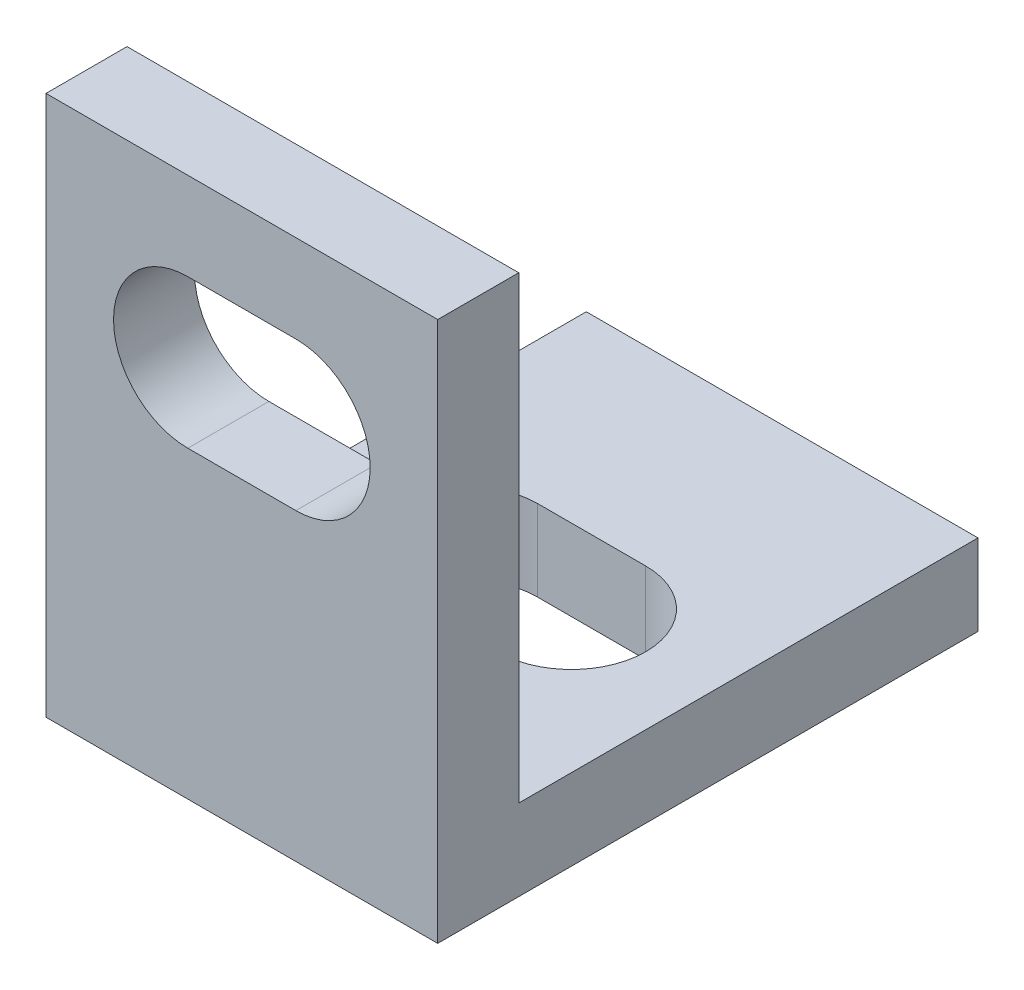
ISO-10303-21;
HEADER;
FILE_DESCRIPTION(('STEP AP214'),'2;1');
FILE_NAME('part.step','',(''),(''),'','','');
FILE_SCHEMA(('AUTOMOTIVE_DESIGN { 1 0 10303 214 1 1 1 1 }'));
ENDSEC;
DATA;
#1=APPLICATION_CONTEXT('core data for automotive mechanical design processes');
#2=APPLICATION_PROTOCOL_DEFINITION('international standard','automotive_design',2000,#1);
#3=PRODUCT_CONTEXT('',#1,'mechanical');
#4=PRODUCT('Part','Part','',(#3));
#5=PRODUCT_RELATED_PRODUCT_CATEGORY('part','',(#4));
#6=PRODUCT_DEFINITION_FORMATION('','',#4);
#7=PRODUCT_DEFINITION_CONTEXT('part definition',#1,'design');
#8=PRODUCT_DEFINITION('design','',#6,#7);
#9=PRODUCT_DEFINITION_SHAPE('','',#8);
#10=(LENGTH_UNIT() NAMED_UNIT(*) SI_UNIT(.MILLI.,.METRE.));
#11=(NAMED_UNIT(*) PLANE_ANGLE_UNIT() SI_UNIT($,.RADIAN.));
#12=(NAMED_UNIT(*) SI_UNIT($,.STERADIAN.) SOLID_ANGLE_UNIT());
#13=UNCERTAINTY_MEASURE_WITH_UNIT(LENGTH_MEASURE(1.E-05),#10,'distance_accuracy_value','');
#14=(GEOMETRIC_REPRESENTATION_CONTEXT(3) GLOBAL_UNCERTAINTY_ASSIGNED_CONTEXT((#13)) GLOBAL_UNIT_ASSIGNED_CONTEXT((#10,
#11,#12)) REPRESENTATION_CONTEXT('',''));
#15=CARTESIAN_POINT('',(0.,0.,0.));
#16=DIRECTION('',(0.,0.,1.));
#17=DIRECTION('',(1.,0.,0.));
#18=AXIS2_PLACEMENT_3D('',#15,#16,#17);
#19=CARTESIAN_POINT('',(14.5,0.,-20.));
#20=DIRECTION('',(0.,1.,0.));
#21=DIRECTION('',(0.,0.,1.));
#22=AXIS2_PLACEMENT_3D('',#19,#20,#21);
#23=PLANE('',#22);
#24=DIRECTION('',(1.,0.,0.));
#25=VECTOR('',#24,1.);
#26=CARTESIAN_POINT('',(5.25,0.,-12.95));
#27=LINE('',#26,#25);
#28=CARTESIAN_POINT('',(5.25,0.,-12.95));
#29=VERTEX_POINT('',#28);
#30=CARTESIAN_POINT('',(9.25,0.,-12.95));
#31=VERTEX_POINT('',#30);
#32=EDGE_CURVE('E151',#29,#31,#27,.T.);
#33=ORIENTED_EDGE('',*,*,#32,.F.);
#34=CARTESIAN_POINT('',(5.25,0.,-10.2));
#35=DIRECTION('',(0.,-1.,0.));
#36=DIRECTION('',(0.,0.,-1.));
#37=AXIS2_PLACEMENT_3D('',#34,#35,#36);
#38=CIRCLE('',#37,2.75);
#39=CARTESIAN_POINT('',(5.25,0.,-7.45));
#40=VERTEX_POINT('',#39);
#41=EDGE_CURVE('E53',#40,#29,#38,.T.);
#42=ORIENTED_EDGE('',*,*,#41,.F.);
#43=DIRECTION('',(-1.,0.,0.));
#44=VECTOR('',#43,1.);
#45=CARTESIAN_POINT('',(5.25,0.,-7.45));
#46=LINE('',#45,#44);
#47=CARTESIAN_POINT('',(9.25,0.,-7.45));
#48=VERTEX_POINT('',#47);
#49=EDGE_CURVE('E157',#48,#40,#46,.T.);
#50=ORIENTED_EDGE('',*,*,#49,.F.);
#51=CARTESIAN_POINT('',(9.25,0.,-10.2));
#52=DIRECTION('',(0.,-1.,0.));
#53=DIRECTION('',(0.,0.,-1.));
#54=AXIS2_PLACEMENT_3D('',#51,#52,#53);
#55=CIRCLE('',#54,2.75);
#56=EDGE_CURVE('E142',#31,#48,#55,.T.);
#57=ORIENTED_EDGE('',*,*,#56,.F.);
#58=EDGE_LOOP('',(#33,#42,#50,#57));
#59=FACE_BOUND('',#58,.T.);
#60=DIRECTION('',(0.,0.,-1.));
#61=VECTOR('',#60,1.);
#62=CARTESIAN_POINT('',(0.,0.,-20.));
#63=LINE('',#62,#61);
#64=CARTESIAN_POINT('',(0.,0.,0.));
#65=VERTEX_POINT('',#64);
#66=CARTESIAN_POINT('',(0.,0.,-20.));
#67=VERTEX_POINT('',#66);
#68=EDGE_CURVE('E198',#65,#67,#63,.T.);
#69=ORIENTED_EDGE('',*,*,#68,.T.);
#70=DIRECTION('',(-1.,0.,0.));
#71=VECTOR('',#70,1.);
#72=CARTESIAN_POINT('',(14.5,0.,-20.));
#73=LINE('',#72,#71);
#74=CARTESIAN_POINT('',(14.5,0.,-20.));
#75=VERTEX_POINT('',#74);
#76=EDGE_CURVE('E239',#75,#67,#73,.T.);
#77=ORIENTED_EDGE('',*,*,#76,.F.);
#78=DIRECTION('',(0.,0.,-1.));
#79=VECTOR('',#78,1.);
#80=CARTESIAN_POINT('',(14.5,0.,-20.));
#81=LINE('',#80,#79);
#82=CARTESIAN_POINT('',(14.5,0.,0.));
#83=VERTEX_POINT('',#82);
#84=EDGE_CURVE('E199',#83,#75,#81,.T.);
#85=ORIENTED_EDGE('',*,*,#84,.F.);
#86=DIRECTION('',(-1.,0.,0.));
#87=VECTOR('',#86,1.);
#88=CARTESIAN_POINT('',(14.5,0.,0.));
#89=LINE('',#88,#87);
#90=EDGE_CURVE('E213',#83,#65,#89,.T.);
#91=ORIENTED_EDGE('',*,*,#90,.T.);
#92=EDGE_LOOP('',(#69,#77,#85,#91));
#93=FACE_BOUND('',#92,.T.);
#94=ADVANCED_FACE('F39',(#59,#93),#23,.F.);
#95=CARTESIAN_POINT('',(14.5,3.,-20.));
#96=DIRECTION('',(0.,0.,1.));
#97=DIRECTION('',(1.,0.,0.));
#98=AXIS2_PLACEMENT_3D('',#95,#96,#97);
#99=PLANE('',#98);
#100=DIRECTION('',(0.,1.,0.));
#101=VECTOR('',#100,1.);
#102=CARTESIAN_POINT('',(0.,3.,-20.));
#103=LINE('',#102,#101);
#104=CARTESIAN_POINT('',(0.,3.,-20.));
#105=VERTEX_POINT('',#104);
#106=EDGE_CURVE('E216',#67,#105,#103,.T.);
#107=ORIENTED_EDGE('',*,*,#106,.T.);
#108=DIRECTION('',(-1.,0.,0.));
#109=VECTOR('',#108,1.);
#110=CARTESIAN_POINT('',(14.5,3.,-20.));
#111=LINE('',#110,#109);
#112=CARTESIAN_POINT('',(14.5,3.,-20.));
#113=VERTEX_POINT('',#112);
#114=EDGE_CURVE('E236',#113,#105,#111,.T.);
#115=ORIENTED_EDGE('',*,*,#114,.F.);
#116=DIRECTION('',(0.,1.,0.));
#117=VECTOR('',#116,1.);
#118=CARTESIAN_POINT('',(14.5,3.,-20.));
#119=LINE('',#118,#117);
#120=EDGE_CURVE('E202',#75,#113,#119,.T.);
#121=ORIENTED_EDGE('',*,*,#120,.F.);
#122=ORIENTED_EDGE('',*,*,#76,.T.);
#123=EDGE_LOOP('',(#107,#115,#121,#122));
#124=FACE_BOUND('',#123,.T.);
#125=ADVANCED_FACE('F267',(#124),#99,.F.);
#126=CARTESIAN_POINT('',(14.5,3.,-3.));
#127=DIRECTION('',(0.,-1.,0.));
#128=DIRECTION('',(0.,0.,-1.));
#129=AXIS2_PLACEMENT_3D('',#126,#127,#128);
#130=PLANE('',#129);
#131=DIRECTION('',(-1.,0.,0.));
#132=VECTOR('',#131,1.);
#133=CARTESIAN_POINT('',(14.5,3.,-7.45));
#134=LINE('',#133,#132);
#135=CARTESIAN_POINT('',(9.25,3.,-7.45));
#136=VERTEX_POINT('',#135);
#137=CARTESIAN_POINT('',(5.25,3.,-7.45));
#138=VERTEX_POINT('',#137);
#139=EDGE_CURVE('E46',#136,#138,#134,.T.);
#140=ORIENTED_EDGE('',*,*,#139,.T.);
#141=CARTESIAN_POINT('',(5.25,3.,-10.2));
#142=DIRECTION('',(0.,-1.,0.));
#143=DIRECTION('',(0.,0.,-1.));
#144=AXIS2_PLACEMENT_3D('',#141,#142,#143);
#145=CIRCLE('',#144,2.75);
#146=CARTESIAN_POINT('',(5.25,3.,-12.95));
#147=VERTEX_POINT('',#146);
#148=EDGE_CURVE('E11',#138,#147,#145,.T.);
#149=ORIENTED_EDGE('',*,*,#148,.T.);
#150=DIRECTION('',(1.,0.,0.));
#151=VECTOR('',#150,1.);
#152=CARTESIAN_POINT('',(14.5,3.,-12.95));
#153=LINE('',#152,#151);
#154=CARTESIAN_POINT('',(9.25,3.,-12.95));
#155=VERTEX_POINT('',#154);
#156=EDGE_CURVE('E242',#147,#155,#153,.T.);
#157=ORIENTED_EDGE('',*,*,#156,.T.);
#158=CARTESIAN_POINT('',(9.25,3.,-10.2));
#159=DIRECTION('',(0.,-1.,0.));
#160=DIRECTION('',(0.,0.,-1.));
#161=AXIS2_PLACEMENT_3D('',#158,#159,#160);
#162=CIRCLE('',#161,2.75);
#163=EDGE_CURVE('E145',#155,#136,#162,.T.);
#164=ORIENTED_EDGE('',*,*,#163,.T.);
#165=EDGE_LOOP('',(#140,#149,#157,#164));
#166=FACE_BOUND('',#165,.T.);
#167=DIRECTION('',(0.,0.,1.));
#168=VECTOR('',#167,1.);
#169=CARTESIAN_POINT('',(0.,3.,-3.));
#170=LINE('',#169,#168);
#171=CARTESIAN_POINT('',(0.,3.,-3.));
#172=VERTEX_POINT('',#171);
#173=EDGE_CURVE('E218',#105,#172,#170,.T.);
#174=ORIENTED_EDGE('',*,*,#173,.T.);
#175=DIRECTION('',(-1.,0.,0.));
#176=VECTOR('',#175,1.);
#177=CARTESIAN_POINT('',(14.5,3.,-3.));
#178=LINE('',#177,#176);
#179=CARTESIAN_POINT('',(14.5,3.,-3.));
#180=VERTEX_POINT('',#179);
#181=EDGE_CURVE('E233',#180,#172,#178,.T.);
#182=ORIENTED_EDGE('',*,*,#181,.F.);
#183=DIRECTION('',(0.,0.,1.));
#184=VECTOR('',#183,1.);
#185=CARTESIAN_POINT('',(14.5,3.,-3.));
#186=LINE('',#185,#184);
#187=EDGE_CURVE('E205',#113,#180,#186,.T.);
#188=ORIENTED_EDGE('',*,*,#187,.F.);
#189=ORIENTED_EDGE('',*,*,#114,.T.);
#190=EDGE_LOOP('',(#174,#182,#188,#189));
#191=FACE_BOUND('',#190,.T.);
#192=ADVANCED_FACE('F246',(#166,#191),#130,.F.);
#193=CARTESIAN_POINT('',(14.5,20.,-3.));
#194=DIRECTION('',(0.,0.,1.));
#195=DIRECTION('',(0.,-1.,0.));
#196=AXIS2_PLACEMENT_3D('',#193,#194,#195);
#197=PLANE('',#196);
#198=CARTESIAN_POINT('',(5.25,14.,-3.));
#199=DIRECTION('',(0.,0.,1.));
#200=DIRECTION('',(0.,-1.,0.));
#201=AXIS2_PLACEMENT_3D('',#198,#199,#200);
#202=CIRCLE('',#201,2.75);
#203=CARTESIAN_POINT('',(5.25,16.75,-3.));
#204=VERTEX_POINT('',#203);
#205=CARTESIAN_POINT('',(5.25,11.25,-3.));
#206=VERTEX_POINT('',#205);
#207=EDGE_CURVE('E192',#204,#206,#202,.T.);
#208=ORIENTED_EDGE('',*,*,#207,.T.);
#209=DIRECTION('',(1.,0.,0.));
#210=VECTOR('',#209,1.);
#211=CARTESIAN_POINT('',(14.5,11.25,-3.));
#212=LINE('',#211,#210);
#213=CARTESIAN_POINT('',(9.25,11.25,-3.));
#214=VERTEX_POINT('',#213);
#215=EDGE_CURVE('E195',#206,#214,#212,.T.);
#216=ORIENTED_EDGE('',*,*,#215,.T.);
#217=CARTESIAN_POINT('',(9.25,14.,-3.));
#218=DIRECTION('',(0.,0.,1.));
#219=DIRECTION('',(0.,-1.,0.));
#220=AXIS2_PLACEMENT_3D('',#217,#218,#219);
#221=CIRCLE('',#220,2.75);
#222=CARTESIAN_POINT('',(9.25,16.75,-3.));
#223=VERTEX_POINT('',#222);
#224=EDGE_CURVE('E180',#214,#223,#221,.T.);
#225=ORIENTED_EDGE('',*,*,#224,.T.);
#226=DIRECTION('',(1.,0.,0.));
#227=VECTOR('',#226,1.);
#228=CARTESIAN_POINT('',(14.5,16.75,-3.));
#229=LINE('',#228,#227);
#230=EDGE_CURVE('E189',#204,#223,#229,.T.);
#231=ORIENTED_EDGE('',*,*,#230,.F.);
#232=EDGE_LOOP('',(#208,#216,#225,#231));
#233=FACE_BOUND('',#232,.T.);
#234=DIRECTION('',(0.,1.,0.));
#235=VECTOR('',#234,1.);
#236=CARTESIAN_POINT('',(0.,20.,-3.));
#237=LINE('',#236,#235);
#238=CARTESIAN_POINT('',(0.,20.,-3.));
#239=VERTEX_POINT('',#238);
#240=EDGE_CURVE('E220',#172,#239,#237,.T.);
#241=ORIENTED_EDGE('',*,*,#240,.T.);
#242=DIRECTION('',(-1.,0.,0.));
#243=VECTOR('',#242,1.);
#244=CARTESIAN_POINT('',(14.5,20.,-3.));
#245=LINE('',#244,#243);
#246=CARTESIAN_POINT('',(14.5,20.,-3.));
#247=VERTEX_POINT('',#246);
#248=EDGE_CURVE('E230',#247,#239,#245,.T.);
#249=ORIENTED_EDGE('',*,*,#248,.F.);
#250=DIRECTION('',(0.,1.,0.));
#251=VECTOR('',#250,1.);
#252=CARTESIAN_POINT('',(14.5,20.,-3.));
#253=LINE('',#252,#251);
#254=EDGE_CURVE('E207',#180,#247,#253,.T.);
#255=ORIENTED_EDGE('',*,*,#254,.F.);
#256=ORIENTED_EDGE('',*,*,#181,.T.);
#257=EDGE_LOOP('',(#241,#249,#255,#256));
#258=FACE_BOUND('',#257,.T.);
#259=ADVANCED_FACE('F275',(#233,#258),#197,.F.);
#260=CARTESIAN_POINT('',(14.5,20.,0.));
#261=DIRECTION('',(0.,-1.,0.));
#262=DIRECTION('',(0.,0.,-1.));
#263=AXIS2_PLACEMENT_3D('',#260,#261,#262);
#264=PLANE('',#263);
#265=DIRECTION('',(0.,0.,1.));
#266=VECTOR('',#265,1.);
#267=CARTESIAN_POINT('',(0.,20.,0.));
#268=LINE('',#267,#266);
#269=CARTESIAN_POINT('',(0.,20.,0.));
#270=VERTEX_POINT('',#269);
#271=EDGE_CURVE('E222',#239,#270,#268,.T.);
#272=ORIENTED_EDGE('',*,*,#271,.T.);
#273=DIRECTION('',(-1.,0.,0.));
#274=VECTOR('',#273,1.);
#275=CARTESIAN_POINT('',(14.5,20.,0.));
#276=LINE('',#275,#274);
#277=CARTESIAN_POINT('',(14.5,20.,0.));
#278=VERTEX_POINT('',#277);
#279=EDGE_CURVE('E227',#278,#270,#276,.T.);
#280=ORIENTED_EDGE('',*,*,#279,.F.);
#281=DIRECTION('',(0.,0.,1.));
#282=VECTOR('',#281,1.);
#283=CARTESIAN_POINT('',(14.5,20.,0.));
#284=LINE('',#283,#282);
#285=EDGE_CURVE('E209',#247,#278,#284,.T.);
#286=ORIENTED_EDGE('',*,*,#285,.F.);
#287=ORIENTED_EDGE('',*,*,#248,.T.);
#288=EDGE_LOOP('',(#272,#280,#286,#287));
#289=FACE_BOUND('',#288,.T.);
#290=ADVANCED_FACE('F280',(#289),#264,.F.);
#291=CARTESIAN_POINT('',(14.5,0.,0.));
#292=DIRECTION('',(0.,0.,-1.));
#293=DIRECTION('',(-1.,0.,0.));
#294=AXIS2_PLACEMENT_3D('',#291,#292,#293);
#295=PLANE('',#294);
#296=CARTESIAN_POINT('',(9.25,14.,0.));
#297=DIRECTION('',(0.,0.,1.));
#298=DIRECTION('',(1.,0.,0.));
#299=AXIS2_PLACEMENT_3D('',#296,#297,#298);
#300=CIRCLE('',#299,2.75);
#301=CARTESIAN_POINT('',(9.25,11.25,0.));
#302=VERTEX_POINT('',#301);
#303=CARTESIAN_POINT('',(9.25,16.75,0.));
#304=VERTEX_POINT('',#303);
#305=EDGE_CURVE('E168',#302,#304,#300,.T.);
#306=ORIENTED_EDGE('',*,*,#305,.F.);
#307=DIRECTION('',(1.,0.,0.));
#308=VECTOR('',#307,1.);
#309=CARTESIAN_POINT('',(5.25,11.25,0.));
#310=LINE('',#309,#308);
#311=CARTESIAN_POINT('',(5.25,11.25,0.));
#312=VERTEX_POINT('',#311);
#313=EDGE_CURVE('E164',#312,#302,#310,.T.);
#314=ORIENTED_EDGE('',*,*,#313,.F.);
#315=CARTESIAN_POINT('',(5.25,14.,0.));
#316=DIRECTION('',(0.,0.,1.));
#317=DIRECTION('',(1.,0.,0.));
#318=AXIS2_PLACEMENT_3D('',#315,#316,#317);
#319=CIRCLE('',#318,2.75);
#320=CARTESIAN_POINT('',(5.25,16.75,0.));
#321=VERTEX_POINT('',#320);
#322=EDGE_CURVE('E174',#321,#312,#319,.T.);
#323=ORIENTED_EDGE('',*,*,#322,.F.);
#324=DIRECTION('',(1.,0.,0.));
#325=VECTOR('',#324,1.);
#326=CARTESIAN_POINT('',(5.25,16.75,0.));
#327=LINE('',#326,#325);
#328=EDGE_CURVE('E171',#321,#304,#327,.T.);
#329=ORIENTED_EDGE('',*,*,#328,.T.);
#330=EDGE_LOOP('',(#306,#314,#323,#329));
#331=FACE_BOUND('',#330,.T.);
#332=DIRECTION('',(0.,-1.,0.));
#333=VECTOR('',#332,1.);
#334=CARTESIAN_POINT('',(0.,0.,0.));
#335=LINE('',#334,#333);
#336=EDGE_CURVE('E203',#270,#65,#335,.T.);
#337=ORIENTED_EDGE('',*,*,#336,.T.);
#338=ORIENTED_EDGE('',*,*,#90,.F.);
#339=DIRECTION('',(0.,-1.,0.));
#340=VECTOR('',#339,1.);
#341=CARTESIAN_POINT('',(14.5,0.,0.));
#342=LINE('',#341,#340);
#343=EDGE_CURVE('E211',#278,#83,#342,.T.);
#344=ORIENTED_EDGE('',*,*,#343,.F.);
#345=ORIENTED_EDGE('',*,*,#279,.T.);
#346=EDGE_LOOP('',(#337,#338,#344,#345));
#347=FACE_BOUND('',#346,.T.);
#348=ADVANCED_FACE('F283',(#331,#347),#295,.F.);
#349=CARTESIAN_POINT('',(14.5,0.,0.));
#350=DIRECTION('',(-1.,0.,0.));
#351=DIRECTION('',(0.,0.,1.));
#352=AXIS2_PLACEMENT_3D('',#349,#350,#351);
#353=PLANE('',#352);
#354=ORIENTED_EDGE('',*,*,#84,.T.);
#355=ORIENTED_EDGE('',*,*,#120,.T.);
#356=ORIENTED_EDGE('',*,*,#187,.T.);
#357=ORIENTED_EDGE('',*,*,#254,.T.);
#358=ORIENTED_EDGE('',*,*,#285,.T.);
#359=ORIENTED_EDGE('',*,*,#343,.T.);
#360=EDGE_LOOP('',(#354,#355,#356,#357,#358,#359));
#361=FACE_BOUND('',#360,.T.);
#362=ADVANCED_FACE('F287',(#361),#353,.F.);
#363=CARTESIAN_POINT('',(0.,0.,0.));
#364=DIRECTION('',(-1.,0.,0.));
#365=DIRECTION('',(0.,0.,1.));
#366=AXIS2_PLACEMENT_3D('',#363,#364,#365);
#367=PLANE('',#366);
#368=ORIENTED_EDGE('',*,*,#68,.F.);
#369=ORIENTED_EDGE('',*,*,#336,.F.);
#370=ORIENTED_EDGE('',*,*,#271,.F.);
#371=ORIENTED_EDGE('',*,*,#240,.F.);
#372=ORIENTED_EDGE('',*,*,#173,.F.);
#373=ORIENTED_EDGE('',*,*,#106,.F.);
#374=EDGE_LOOP('',(#368,#369,#370,#371,#372,#373));
#375=FACE_BOUND('',#374,.T.);
#376=ADVANCED_FACE('F289',(#375),#367,.T.);
#377=CARTESIAN_POINT('',(5.25,11.25,-20.));
#378=DIRECTION('',(0.,-1.,0.));
#379=DIRECTION('',(0.,0.,-1.));
#380=AXIS2_PLACEMENT_3D('',#377,#378,#379);
#381=PLANE('',#380);
#382=DIRECTION('',(0.,0.,1.));
#383=VECTOR('',#382,1.);
#384=CARTESIAN_POINT('',(5.25,11.25,-20.));
#385=LINE('',#384,#383);
#386=EDGE_CURVE('E178',#206,#312,#385,.T.);
#387=ORIENTED_EDGE('',*,*,#386,.T.);
#388=ORIENTED_EDGE('',*,*,#313,.T.);
#389=DIRECTION('',(0.,0.,1.));
#390=VECTOR('',#389,1.);
#391=CARTESIAN_POINT('',(9.25,11.25,-20.));
#392=LINE('',#391,#390);
#393=EDGE_CURVE('E177',#214,#302,#392,.T.);
#394=ORIENTED_EDGE('',*,*,#393,.F.);
#395=ORIENTED_EDGE('',*,*,#215,.F.);
#396=EDGE_LOOP('',(#387,#388,#394,#395));
#397=FACE_BOUND('',#396,.T.);
#398=ADVANCED_FACE('F292',(#397),#381,.F.);
#399=CARTESIAN_POINT('',(5.25,14.,-20.));
#400=DIRECTION('',(0.,0.,1.));
#401=DIRECTION('',(1.,0.,0.));
#402=AXIS2_PLACEMENT_3D('',#399,#400,#401);
#403=CYLINDRICAL_SURFACE('',#402,2.75);
#404=DIRECTION('',(0.,0.,1.));
#405=VECTOR('',#404,1.);
#406=CARTESIAN_POINT('',(5.25,16.75,-20.));
#407=LINE('',#406,#405);
#408=EDGE_CURVE('E181',#204,#321,#407,.T.);
#409=ORIENTED_EDGE('',*,*,#408,.T.);
#410=ORIENTED_EDGE('',*,*,#322,.T.);
#411=ORIENTED_EDGE('',*,*,#386,.F.);
#412=ORIENTED_EDGE('',*,*,#207,.F.);
#413=EDGE_LOOP('',(#409,#410,#411,#412));
#414=FACE_BOUND('',#413,.T.);
#415=ADVANCED_FACE('F298',(#414),#403,.F.);
#416=CARTESIAN_POINT('',(5.25,16.75,-20.));
#417=DIRECTION('',(0.,-1.,0.));
#418=DIRECTION('',(0.,0.,-1.));
#419=AXIS2_PLACEMENT_3D('',#416,#417,#418);
#420=PLANE('',#419);
#421=ORIENTED_EDGE('',*,*,#230,.T.);
#422=DIRECTION('',(0.,0.,1.));
#423=VECTOR('',#422,1.);
#424=CARTESIAN_POINT('',(9.25,16.75,-20.));
#425=LINE('',#424,#423);
#426=EDGE_CURVE('E183',#223,#304,#425,.T.);
#427=ORIENTED_EDGE('',*,*,#426,.T.);
#428=ORIENTED_EDGE('',*,*,#328,.F.);
#429=ORIENTED_EDGE('',*,*,#408,.F.);
#430=EDGE_LOOP('',(#421,#427,#428,#429));
#431=FACE_BOUND('',#430,.T.);
#432=ADVANCED_FACE('F261',(#431),#420,.T.);
#433=CARTESIAN_POINT('',(9.25,14.,-20.));
#434=DIRECTION('',(0.,0.,1.));
#435=DIRECTION('',(1.,0.,0.));
#436=AXIS2_PLACEMENT_3D('',#433,#434,#435);
#437=CYLINDRICAL_SURFACE('',#436,2.75);
#438=ORIENTED_EDGE('',*,*,#393,.T.);
#439=ORIENTED_EDGE('',*,*,#305,.T.);
#440=ORIENTED_EDGE('',*,*,#426,.F.);
#441=ORIENTED_EDGE('',*,*,#224,.F.);
#442=EDGE_LOOP('',(#438,#439,#440,#441));
#443=FACE_BOUND('',#442,.T.);
#444=ADVANCED_FACE('F253',(#443),#437,.F.);
#445=CARTESIAN_POINT('',(5.25,20.,-10.2));
#446=DIRECTION('',(0.,-1.,0.));
#447=DIRECTION('',(0.,0.,-1.));
#448=AXIS2_PLACEMENT_3D('',#445,#446,#447);
#449=CYLINDRICAL_SURFACE('',#448,2.75);
#450=DIRECTION('',(0.,-1.,0.));
#451=VECTOR('',#450,1.);
#452=CARTESIAN_POINT('',(5.25,20.,-7.45));
#453=LINE('',#452,#451);
#454=EDGE_CURVE('E162',#138,#40,#453,.T.);
#455=ORIENTED_EDGE('',*,*,#454,.T.);
#456=ORIENTED_EDGE('',*,*,#41,.T.);
#457=DIRECTION('',(0.,-1.,0.));
#458=VECTOR('',#457,1.);
#459=CARTESIAN_POINT('',(5.25,20.,-12.95));
#460=LINE('',#459,#458);
#461=EDGE_CURVE('E148',#147,#29,#460,.T.);
#462=ORIENTED_EDGE('',*,*,#461,.F.);
#463=ORIENTED_EDGE('',*,*,#148,.F.);
#464=EDGE_LOOP('',(#455,#456,#462,#463));
#465=FACE_BOUND('',#464,.T.);
#466=ADVANCED_FACE('F251',(#465),#449,.F.);
#467=CARTESIAN_POINT('',(5.25,20.,-7.45));
#468=DIRECTION('',(0.,0.,1.));
#469=DIRECTION('',(1.,0.,0.));
#470=AXIS2_PLACEMENT_3D('',#467,#468,#469);
#471=PLANE('',#470);
#472=DIRECTION('',(0.,-1.,0.));
#473=VECTOR('',#472,1.);
#474=CARTESIAN_POINT('',(9.25,20.,-7.45));
#475=LINE('',#474,#473);
#476=EDGE_CURVE('E147',#136,#48,#475,.T.);
#477=ORIENTED_EDGE('',*,*,#476,.T.);
#478=ORIENTED_EDGE('',*,*,#49,.T.);
#479=ORIENTED_EDGE('',*,*,#454,.F.);
#480=ORIENTED_EDGE('',*,*,#139,.F.);
#481=EDGE_LOOP('',(#477,#478,#479,#480));
#482=FACE_BOUND('',#481,.T.);
#483=ADVANCED_FACE('F250',(#482),#471,.F.);
#484=CARTESIAN_POINT('',(9.25,20.,-10.2));
#485=DIRECTION('',(0.,-1.,0.));
#486=DIRECTION('',(0.,0.,-1.));
#487=AXIS2_PLACEMENT_3D('',#484,#485,#486);
#488=CYLINDRICAL_SURFACE('',#487,2.75);
#489=DIRECTION('',(0.,-1.,0.));
#490=VECTOR('',#489,1.);
#491=CARTESIAN_POINT('',(9.25,20.,-12.95));
#492=LINE('',#491,#490);
#493=EDGE_CURVE('E61',#155,#31,#492,.T.);
#494=ORIENTED_EDGE('',*,*,#493,.T.);
#495=ORIENTED_EDGE('',*,*,#56,.T.);
#496=ORIENTED_EDGE('',*,*,#476,.F.);
#497=ORIENTED_EDGE('',*,*,#163,.F.);
#498=EDGE_LOOP('',(#494,#495,#496,#497));
#499=FACE_BOUND('',#498,.T.);
#500=ADVANCED_FACE('F139',(#499),#488,.F.);
#501=CARTESIAN_POINT('',(5.25,20.,-12.95));
#502=DIRECTION('',(0.,0.,-1.));
#503=DIRECTION('',(0.,1.,0.));
#504=AXIS2_PLACEMENT_3D('',#501,#502,#503);
#505=PLANE('',#504);
#506=ORIENTED_EDGE('',*,*,#461,.T.);
#507=ORIENTED_EDGE('',*,*,#32,.T.);
#508=ORIENTED_EDGE('',*,*,#493,.F.);
#509=ORIENTED_EDGE('',*,*,#156,.F.);
#510=EDGE_LOOP('',(#506,#507,#508,#509));
#511=FACE_BOUND('',#510,.T.);
#512=ADVANCED_FACE('F152',(#511),#505,.F.);
#513=CLOSED_SHELL('',(#94,#125,#192,#259,#290,#348,#362,#376,#398,#415,#432,#444,#466,#483,#500,#512));
#514=MANIFOLD_SOLID_BREP('B2',#513);
#515=ADVANCED_BREP_SHAPE_REPRESENTATION('',(#18,#514),#14);
#516=SHAPE_DEFINITION_REPRESENTATION(#9,#515);
ENDSEC;
END-ISO-10303-21;
